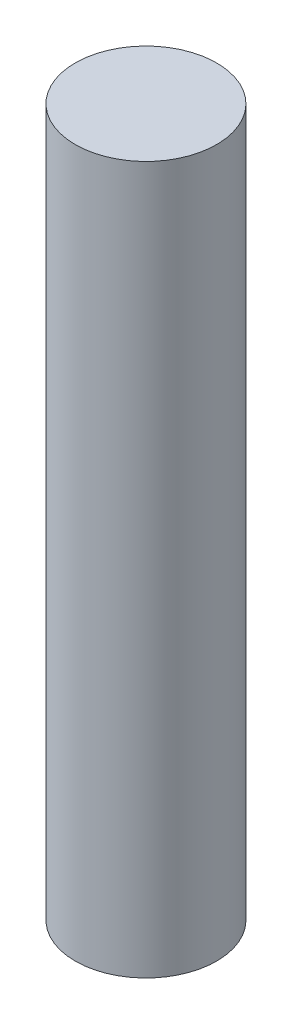
ISO-10303-21;
HEADER;
FILE_DESCRIPTION(('STEP AP214'),'2;1');
FILE_NAME('part.step','',(''),(''),'','','');
FILE_SCHEMA(('AUTOMOTIVE_DESIGN { 1 0 10303 214 1 1 1 1 }'));
ENDSEC;
DATA;
#1=APPLICATION_CONTEXT('core data for automotive mechanical design processes');
#2=APPLICATION_PROTOCOL_DEFINITION('international standard','automotive_design',2000,#1);
#3=PRODUCT_CONTEXT('',#1,'mechanical');
#4=PRODUCT('Part','Part','',(#3));
#5=PRODUCT_RELATED_PRODUCT_CATEGORY('part','',(#4));
#6=PRODUCT_DEFINITION_FORMATION('','',#4);
#7=PRODUCT_DEFINITION_CONTEXT('part definition',#1,'design');
#8=PRODUCT_DEFINITION('design','',#6,#7);
#9=PRODUCT_DEFINITION_SHAPE('','',#8);
#10=(LENGTH_UNIT() NAMED_UNIT(*) SI_UNIT(.MILLI.,.METRE.));
#11=(NAMED_UNIT(*) PLANE_ANGLE_UNIT() SI_UNIT($,.RADIAN.));
#12=(NAMED_UNIT(*) SI_UNIT($,.STERADIAN.) SOLID_ANGLE_UNIT());
#13=UNCERTAINTY_MEASURE_WITH_UNIT(LENGTH_MEASURE(1.E-05),#10,'distance_accuracy_value','');
#14=(GEOMETRIC_REPRESENTATION_CONTEXT(3) GLOBAL_UNCERTAINTY_ASSIGNED_CONTEXT((#13)) GLOBAL_UNIT_ASSIGNED_CONTEXT((#10,
#11,#12)) REPRESENTATION_CONTEXT('',''));
#15=CARTESIAN_POINT('',(0.,0.,0.));
#16=DIRECTION('',(0.,0.,1.));
#17=DIRECTION('',(1.,0.,0.));
#18=AXIS2_PLACEMENT_3D('',#15,#16,#17);
#19=CARTESIAN_POINT('',(0.,35.,0.));
#20=DIRECTION('',(0.,-1.,0.));
#21=DIRECTION('',(0.,0.,-1.));
#22=AXIS2_PLACEMENT_3D('',#19,#20,#21);
#23=CYLINDRICAL_SURFACE('',#22,6.);
#24=CARTESIAN_POINT('',(0.,35.,0.));
#25=DIRECTION('',(0.,1.,0.));
#26=DIRECTION('',(0.,0.,1.));
#27=AXIS2_PLACEMENT_3D('',#24,#25,#26);
#28=CIRCLE('',#27,6.);
#29=CARTESIAN_POINT('',(0.,35.,6.));
#30=VERTEX_POINT('',#29);
#31=EDGE_CURVE('E10',#30,#30,#28,.T.);
#32=ORIENTED_EDGE('',*,*,#31,.F.);
#33=EDGE_LOOP('',(#32));
#34=FACE_BOUND('',#33,.T.);
#35=CARTESIAN_POINT('',(0.,-25.,0.));
#36=DIRECTION('',(0.,1.,0.));
#37=DIRECTION('',(0.,0.,1.));
#38=AXIS2_PLACEMENT_3D('',#35,#36,#37);
#39=CIRCLE('',#38,6.);
#40=CARTESIAN_POINT('',(0.,-25.,6.));
#41=VERTEX_POINT('',#40);
#42=EDGE_CURVE('E39',#41,#41,#39,.T.);
#43=ORIENTED_EDGE('',*,*,#42,.T.);
#44=EDGE_LOOP('',(#43));
#45=FACE_BOUND('',#44,.T.);
#46=ADVANCED_FACE('F36',(#34,#45),#23,.T.);
#47=CARTESIAN_POINT('',(0.,35.,0.));
#48=DIRECTION('',(0.,1.,0.));
#49=DIRECTION('',(0.,0.,1.));
#50=AXIS2_PLACEMENT_3D('',#47,#48,#49);
#51=PLANE('',#50);
#52=ORIENTED_EDGE('',*,*,#31,.T.);
#53=EDGE_LOOP('',(#52));
#54=FACE_BOUND('',#53,.T.);
#55=ADVANCED_FACE('F51',(#54),#51,.T.);
#56=CARTESIAN_POINT('',(0.,-25.,0.));
#57=DIRECTION('',(0.,1.,0.));
#58=DIRECTION('',(0.,0.,1.));
#59=AXIS2_PLACEMENT_3D('',#56,#57,#58);
#60=PLANE('',#59);
#61=ORIENTED_EDGE('',*,*,#42,.F.);
#62=EDGE_LOOP('',(#61));
#63=FACE_BOUND('',#62,.T.);
#64=ADVANCED_FACE('F49',(#63),#60,.F.);
#65=CLOSED_SHELL('',(#46,#55,#64));
#66=MANIFOLD_SOLID_BREP('B2',#65);
#67=ADVANCED_BREP_SHAPE_REPRESENTATION('',(#18,#66),#14);
#68=SHAPE_DEFINITION_REPRESENTATION(#9,#67);
ENDSEC;
END-ISO-10303-21;
